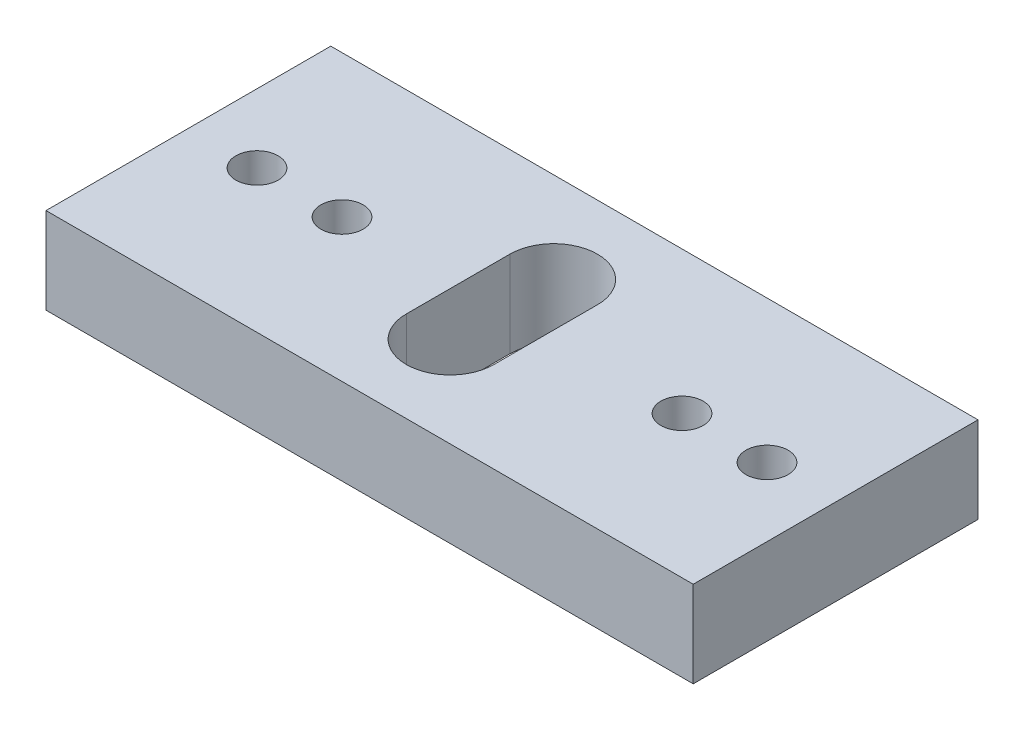
ISO-10303-21;
HEADER;
FILE_DESCRIPTION(('STEP AP214'),'2;1');
FILE_NAME('part.step','',(''),(''),'','','');
FILE_SCHEMA(('AUTOMOTIVE_DESIGN { 1 0 10303 214 1 1 1 1 }'));
ENDSEC;
DATA;
#1=APPLICATION_CONTEXT('core data for automotive mechanical design processes');
#2=APPLICATION_PROTOCOL_DEFINITION('international standard','automotive_design',2000,#1);
#3=PRODUCT_CONTEXT('',#1,'mechanical');
#4=PRODUCT('Part','Part','',(#3));
#5=PRODUCT_RELATED_PRODUCT_CATEGORY('part','',(#4));
#6=PRODUCT_DEFINITION_FORMATION('','',#4);
#7=PRODUCT_DEFINITION_CONTEXT('part definition',#1,'design');
#8=PRODUCT_DEFINITION('design','',#6,#7);
#9=PRODUCT_DEFINITION_SHAPE('','',#8);
#10=(LENGTH_UNIT() NAMED_UNIT(*) SI_UNIT(.MILLI.,.METRE.));
#11=(NAMED_UNIT(*) PLANE_ANGLE_UNIT() SI_UNIT($,.RADIAN.));
#12=(NAMED_UNIT(*) SI_UNIT($,.STERADIAN.) SOLID_ANGLE_UNIT());
#13=UNCERTAINTY_MEASURE_WITH_UNIT(LENGTH_MEASURE(1.E-05),#10,'distance_accuracy_value','');
#14=(GEOMETRIC_REPRESENTATION_CONTEXT(3) GLOBAL_UNCERTAINTY_ASSIGNED_CONTEXT((#13)) GLOBAL_UNIT_ASSIGNED_CONTEXT((#10,
#11,#12)) REPRESENTATION_CONTEXT('',''));
#15=CARTESIAN_POINT('',(0.,0.,0.));
#16=DIRECTION('',(0.,0.,1.));
#17=DIRECTION('',(1.,0.,0.));
#18=AXIS2_PLACEMENT_3D('',#15,#16,#17);
#19=CARTESIAN_POINT('',(0.,5.08,0.));
#20=DIRECTION('',(0.,-1.,0.));
#21=DIRECTION('',(0.,0.,-1.));
#22=AXIS2_PLACEMENT_3D('',#19,#20,#21);
#23=PLANE('',#22);
#24=CARTESIAN_POINT('',(-15.0114,5.08,0.));
#25=DIRECTION('',(0.,1.,0.));
#26=DIRECTION('',(0.,0.,1.));
#27=AXIS2_PLACEMENT_3D('',#24,#25,#26);
#28=CIRCLE('',#27,1.2446);
#29=CARTESIAN_POINT('',(-15.0114,5.08,1.2446));
#30=VERTEX_POINT('',#29);
#31=EDGE_CURVE('E137',#30,#30,#28,.T.);
#32=ORIENTED_EDGE('',*,*,#31,.F.);
#33=EDGE_LOOP('',(#32));
#34=FACE_BOUND('',#33,.T.);
#35=CARTESIAN_POINT('',(-10.0076,5.08,0.));
#36=DIRECTION('',(0.,1.,0.));
#37=DIRECTION('',(0.,0.,1.));
#38=AXIS2_PLACEMENT_3D('',#35,#36,#37);
#39=CIRCLE('',#38,1.2446);
#40=CARTESIAN_POINT('',(-10.0076,5.08,1.2446));
#41=VERTEX_POINT('',#40);
#42=EDGE_CURVE('E143',#41,#41,#39,.T.);
#43=ORIENTED_EDGE('',*,*,#42,.F.);
#44=EDGE_LOOP('',(#43));
#45=FACE_BOUND('',#44,.T.);
#46=DIRECTION('',(0.,0.,1.));
#47=VECTOR('',#46,1.);
#48=CARTESIAN_POINT('',(-19.05,5.08,-8.382));
#49=LINE('',#48,#47);
#50=CARTESIAN_POINT('',(-19.05,5.08,-8.382));
#51=VERTEX_POINT('',#50);
#52=CARTESIAN_POINT('',(-19.05,5.08,8.382));
#53=VERTEX_POINT('',#52);
#54=EDGE_CURVE('E149',#51,#53,#49,.T.);
#55=ORIENTED_EDGE('',*,*,#54,.T.);
#56=DIRECTION('',(1.,0.,0.));
#57=VECTOR('',#56,1.);
#58=CARTESIAN_POINT('',(19.05,5.08,8.382));
#59=LINE('',#58,#57);
#60=CARTESIAN_POINT('',(19.05,5.08,8.382));
#61=VERTEX_POINT('',#60);
#62=EDGE_CURVE('E152',#53,#61,#59,.T.);
#63=ORIENTED_EDGE('',*,*,#62,.T.);
#64=DIRECTION('',(0.,0.,-1.));
#65=VECTOR('',#64,1.);
#66=CARTESIAN_POINT('',(19.05,5.08,-8.382));
#67=LINE('',#66,#65);
#68=CARTESIAN_POINT('',(19.05,5.08,-8.382));
#69=VERTEX_POINT('',#68);
#70=EDGE_CURVE('E155',#61,#69,#67,.T.);
#71=ORIENTED_EDGE('',*,*,#70,.T.);
#72=DIRECTION('',(-1.,0.,0.));
#73=VECTOR('',#72,1.);
#74=CARTESIAN_POINT('',(19.05,5.08,-8.382));
#75=LINE('',#74,#73);
#76=EDGE_CURVE('E157',#69,#51,#75,.T.);
#77=ORIENTED_EDGE('',*,*,#76,.T.);
#78=EDGE_LOOP('',(#55,#63,#71,#77));
#79=FACE_BOUND('',#78,.T.);
#80=CARTESIAN_POINT('',(-0.595312500000001,5.08,-3.048));
#81=DIRECTION('',(0.,1.,0.));
#82=DIRECTION('',(0.,0.,1.));
#83=AXIS2_PLACEMENT_3D('',#80,#81,#82);
#84=CIRCLE('',#83,2.5796875);
#85=CARTESIAN_POINT('',(1.984375,5.08,-3.048));
#86=VERTEX_POINT('',#85);
#87=CARTESIAN_POINT('',(-3.175,5.08,-3.048));
#88=VERTEX_POINT('',#87);
#89=EDGE_CURVE('E98',#86,#88,#84,.T.);
#90=ORIENTED_EDGE('',*,*,#89,.F.);
#91=DIRECTION('',(0.,0.,-1.));
#92=VECTOR('',#91,1.);
#93=CARTESIAN_POINT('',(1.984375,5.08,3.048));
#94=LINE('',#93,#92);
#95=CARTESIAN_POINT('',(1.984375,5.08,3.048));
#96=VERTEX_POINT('',#95);
#97=EDGE_CURVE('E121',#96,#86,#94,.T.);
#98=ORIENTED_EDGE('',*,*,#97,.F.);
#99=CARTESIAN_POINT('',(-0.5953125,5.08,3.048));
#100=DIRECTION('',(0.,1.,0.));
#101=DIRECTION('',(0.,0.,-1.));
#102=AXIS2_PLACEMENT_3D('',#99,#100,#101);
#103=CIRCLE('',#102,2.5796875);
#104=CARTESIAN_POINT('',(-3.175,5.08,3.048));
#105=VERTEX_POINT('',#104);
#106=EDGE_CURVE('E119',#105,#96,#103,.T.);
#107=ORIENTED_EDGE('',*,*,#106,.F.);
#108=DIRECTION('',(0.,0.,1.));
#109=VECTOR('',#108,1.);
#110=CARTESIAN_POINT('',(-3.175,5.08,3.048));
#111=LINE('',#110,#109);
#112=EDGE_CURVE('E106',#88,#105,#111,.T.);
#113=ORIENTED_EDGE('',*,*,#112,.F.);
#114=EDGE_LOOP('',(#90,#98,#107,#113));
#115=FACE_BOUND('',#114,.T.);
#116=CARTESIAN_POINT('',(15.0114,5.08,0.));
#117=DIRECTION('',(0.,1.,0.));
#118=DIRECTION('',(0.,0.,-1.));
#119=AXIS2_PLACEMENT_3D('',#116,#117,#118);
#120=CIRCLE('',#119,1.2446);
#121=CARTESIAN_POINT('',(15.0114,5.08,-1.2446));
#122=VERTEX_POINT('',#121);
#123=EDGE_CURVE('E127',#122,#122,#120,.T.);
#124=ORIENTED_EDGE('',*,*,#123,.F.);
#125=EDGE_LOOP('',(#124));
#126=FACE_BOUND('',#125,.T.);
#127=CARTESIAN_POINT('',(10.0076,5.08,0.));
#128=DIRECTION('',(0.,1.,0.));
#129=DIRECTION('',(0.,0.,-1.));
#130=AXIS2_PLACEMENT_3D('',#127,#128,#129);
#131=CIRCLE('',#130,1.2446);
#132=CARTESIAN_POINT('',(10.0076,5.08,-1.2446));
#133=VERTEX_POINT('',#132);
#134=EDGE_CURVE('E254',#133,#133,#131,.T.);
#135=ORIENTED_EDGE('',*,*,#134,.F.);
#136=EDGE_LOOP('',(#135));
#137=FACE_BOUND('',#136,.T.);
#138=ADVANCED_FACE('F33',(#34,#45,#79,#115,#126,#137),#23,.F.);
#139=CARTESIAN_POINT('',(0.,0.,0.));
#140=DIRECTION('',(0.,-1.,0.));
#141=DIRECTION('',(0.,0.,-1.));
#142=AXIS2_PLACEMENT_3D('',#139,#140,#141);
#143=PLANE('',#142);
#144=CARTESIAN_POINT('',(15.0114,0.,0.));
#145=DIRECTION('',(0.,1.,0.));
#146=DIRECTION('',(0.,0.,-1.));
#147=AXIS2_PLACEMENT_3D('',#144,#145,#146);
#148=CIRCLE('',#147,1.2446);
#149=CARTESIAN_POINT('',(15.0114,0.,-1.2446));
#150=VERTEX_POINT('',#149);
#151=EDGE_CURVE('E260',#150,#150,#148,.T.);
#152=ORIENTED_EDGE('',*,*,#151,.T.);
#153=EDGE_LOOP('',(#152));
#154=FACE_BOUND('',#153,.T.);
#155=CARTESIAN_POINT('',(-10.0076,0.,0.));
#156=DIRECTION('',(0.,1.,0.));
#157=DIRECTION('',(0.,0.,1.));
#158=AXIS2_PLACEMENT_3D('',#155,#156,#157);
#159=CIRCLE('',#158,1.2446);
#160=CARTESIAN_POINT('',(-10.0076,0.,1.2446));
#161=VERTEX_POINT('',#160);
#162=EDGE_CURVE('E140',#161,#161,#159,.T.);
#163=ORIENTED_EDGE('',*,*,#162,.T.);
#164=EDGE_LOOP('',(#163));
#165=FACE_BOUND('',#164,.T.);
#166=DIRECTION('',(0.,0.,1.));
#167=VECTOR('',#166,1.);
#168=CARTESIAN_POINT('',(-19.05,0.,-8.382));
#169=LINE('',#168,#167);
#170=CARTESIAN_POINT('',(-19.05,0.,-8.382));
#171=VERTEX_POINT('',#170);
#172=CARTESIAN_POINT('',(-19.05,0.,8.382));
#173=VERTEX_POINT('',#172);
#174=EDGE_CURVE('E146',#171,#173,#169,.T.);
#175=ORIENTED_EDGE('',*,*,#174,.F.);
#176=DIRECTION('',(-1.,0.,0.));
#177=VECTOR('',#176,1.);
#178=CARTESIAN_POINT('',(19.05,0.,-8.382));
#179=LINE('',#178,#177);
#180=CARTESIAN_POINT('',(19.05,0.,-8.382));
#181=VERTEX_POINT('',#180);
#182=EDGE_CURVE('E153',#181,#171,#179,.T.);
#183=ORIENTED_EDGE('',*,*,#182,.F.);
#184=DIRECTION('',(0.,0.,-1.));
#185=VECTOR('',#184,1.);
#186=CARTESIAN_POINT('',(19.05,0.,-8.382));
#187=LINE('',#186,#185);
#188=CARTESIAN_POINT('',(19.05,0.,8.382));
#189=VERTEX_POINT('',#188);
#190=EDGE_CURVE('E164',#189,#181,#187,.T.);
#191=ORIENTED_EDGE('',*,*,#190,.F.);
#192=DIRECTION('',(1.,0.,0.));
#193=VECTOR('',#192,1.);
#194=CARTESIAN_POINT('',(19.05,0.,8.382));
#195=LINE('',#194,#193);
#196=EDGE_CURVE('E162',#173,#189,#195,.T.);
#197=ORIENTED_EDGE('',*,*,#196,.F.);
#198=EDGE_LOOP('',(#175,#183,#191,#197));
#199=FACE_BOUND('',#198,.T.);
#200=CARTESIAN_POINT('',(-15.0114,0.,0.));
#201=DIRECTION('',(0.,1.,0.));
#202=DIRECTION('',(0.,0.,1.));
#203=AXIS2_PLACEMENT_3D('',#200,#201,#202);
#204=CIRCLE('',#203,1.2446);
#205=CARTESIAN_POINT('',(-15.0114,0.,1.2446));
#206=VERTEX_POINT('',#205);
#207=EDGE_CURVE('E114',#206,#206,#204,.T.);
#208=ORIENTED_EDGE('',*,*,#207,.T.);
#209=EDGE_LOOP('',(#208));
#210=FACE_BOUND('',#209,.T.);
#211=DIRECTION('',(0.,0.,-1.));
#212=VECTOR('',#211,1.);
#213=CARTESIAN_POINT('',(1.984375,0.,3.048));
#214=LINE('',#213,#212);
#215=CARTESIAN_POINT('',(1.984375,0.,3.048));
#216=VERTEX_POINT('',#215);
#217=CARTESIAN_POINT('',(1.984375,0.,-3.048));
#218=VERTEX_POINT('',#217);
#219=EDGE_CURVE('E107',#216,#218,#214,.T.);
#220=ORIENTED_EDGE('',*,*,#219,.T.);
#221=CARTESIAN_POINT('',(-0.595312500000001,0.,-3.048));
#222=DIRECTION('',(0.,1.,0.));
#223=DIRECTION('',(0.,0.,1.));
#224=AXIS2_PLACEMENT_3D('',#221,#222,#223);
#225=CIRCLE('',#224,2.5796875);
#226=CARTESIAN_POINT('',(-3.175,0.,-3.048));
#227=VERTEX_POINT('',#226);
#228=EDGE_CURVE('E56',#218,#227,#225,.T.);
#229=ORIENTED_EDGE('',*,*,#228,.T.);
#230=DIRECTION('',(0.,0.,1.));
#231=VECTOR('',#230,1.);
#232=CARTESIAN_POINT('',(-3.175,0.,3.048));
#233=LINE('',#232,#231);
#234=CARTESIAN_POINT('',(-3.175,0.,3.048));
#235=VERTEX_POINT('',#234);
#236=EDGE_CURVE('E113',#227,#235,#233,.T.);
#237=ORIENTED_EDGE('',*,*,#236,.T.);
#238=CARTESIAN_POINT('',(-0.5953125,0.,3.048));
#239=DIRECTION('',(0.,1.,0.));
#240=DIRECTION('',(0.,0.,-1.));
#241=AXIS2_PLACEMENT_3D('',#238,#239,#240);
#242=CIRCLE('',#241,2.5796875);
#243=EDGE_CURVE('E129',#235,#216,#242,.T.);
#244=ORIENTED_EDGE('',*,*,#243,.T.);
#245=EDGE_LOOP('',(#220,#229,#237,#244));
#246=FACE_BOUND('',#245,.T.);
#247=CARTESIAN_POINT('',(10.0076,0.,0.));
#248=DIRECTION('',(0.,1.,0.));
#249=DIRECTION('',(0.,0.,-1.));
#250=AXIS2_PLACEMENT_3D('',#247,#248,#249);
#251=CIRCLE('',#250,1.2446);
#252=CARTESIAN_POINT('',(10.0076,0.,-1.2446));
#253=VERTEX_POINT('',#252);
#254=EDGE_CURVE('E257',#253,#253,#251,.T.);
#255=ORIENTED_EDGE('',*,*,#254,.T.);
#256=EDGE_LOOP('',(#255));
#257=FACE_BOUND('',#256,.T.);
#258=ADVANCED_FACE('F182',(#154,#165,#199,#210,#246,#257),#143,.T.);
#259=CARTESIAN_POINT('',(-19.05,5.08,-8.382));
#260=DIRECTION('',(1.,0.,0.));
#261=DIRECTION('',(0.,0.,-1.));
#262=AXIS2_PLACEMENT_3D('',#259,#260,#261);
#263=PLANE('',#262);
#264=ORIENTED_EDGE('',*,*,#174,.T.);
#265=DIRECTION('',(0.,-1.,0.));
#266=VECTOR('',#265,1.);
#267=CARTESIAN_POINT('',(-19.05,5.08,8.382));
#268=LINE('',#267,#266);
#269=EDGE_CURVE('E11',#53,#173,#268,.T.);
#270=ORIENTED_EDGE('',*,*,#269,.F.);
#271=ORIENTED_EDGE('',*,*,#54,.F.);
#272=DIRECTION('',(0.,-1.,0.));
#273=VECTOR('',#272,1.);
#274=CARTESIAN_POINT('',(-19.05,5.08,-8.382));
#275=LINE('',#274,#273);
#276=EDGE_CURVE('E159',#51,#171,#275,.T.);
#277=ORIENTED_EDGE('',*,*,#276,.T.);
#278=EDGE_LOOP('',(#264,#270,#271,#277));
#279=FACE_BOUND('',#278,.T.);
#280=ADVANCED_FACE('F35',(#279),#263,.F.);
#281=CARTESIAN_POINT('',(19.05,5.08,8.382));
#282=DIRECTION('',(0.,0.,-1.));
#283=DIRECTION('',(-1.,0.,0.));
#284=AXIS2_PLACEMENT_3D('',#281,#282,#283);
#285=PLANE('',#284);
#286=ORIENTED_EDGE('',*,*,#196,.T.);
#287=DIRECTION('',(0.,-1.,0.));
#288=VECTOR('',#287,1.);
#289=CARTESIAN_POINT('',(19.05,5.08,8.382));
#290=LINE('',#289,#288);
#291=EDGE_CURVE('E41',#61,#189,#290,.T.);
#292=ORIENTED_EDGE('',*,*,#291,.F.);
#293=ORIENTED_EDGE('',*,*,#62,.F.);
#294=ORIENTED_EDGE('',*,*,#269,.T.);
#295=EDGE_LOOP('',(#286,#292,#293,#294));
#296=FACE_BOUND('',#295,.T.);
#297=ADVANCED_FACE('F192',(#296),#285,.F.);
#298=CARTESIAN_POINT('',(19.05,5.08,-8.382));
#299=DIRECTION('',(-1.,0.,0.));
#300=DIRECTION('',(0.,0.,1.));
#301=AXIS2_PLACEMENT_3D('',#298,#299,#300);
#302=PLANE('',#301);
#303=ORIENTED_EDGE('',*,*,#190,.T.);
#304=DIRECTION('',(0.,-1.,0.));
#305=VECTOR('',#304,1.);
#306=CARTESIAN_POINT('',(19.05,5.08,-8.382));
#307=LINE('',#306,#305);
#308=EDGE_CURVE('E169',#69,#181,#307,.T.);
#309=ORIENTED_EDGE('',*,*,#308,.F.);
#310=ORIENTED_EDGE('',*,*,#70,.F.);
#311=ORIENTED_EDGE('',*,*,#291,.T.);
#312=EDGE_LOOP('',(#303,#309,#310,#311));
#313=FACE_BOUND('',#312,.T.);
#314=ADVANCED_FACE('F176',(#313),#302,.F.);
#315=CARTESIAN_POINT('',(19.05,5.08,-8.382));
#316=DIRECTION('',(0.,0.,1.));
#317=DIRECTION('',(1.,0.,0.));
#318=AXIS2_PLACEMENT_3D('',#315,#316,#317);
#319=PLANE('',#318);
#320=ORIENTED_EDGE('',*,*,#182,.T.);
#321=ORIENTED_EDGE('',*,*,#276,.F.);
#322=ORIENTED_EDGE('',*,*,#76,.F.);
#323=ORIENTED_EDGE('',*,*,#308,.T.);
#324=EDGE_LOOP('',(#320,#321,#322,#323));
#325=FACE_BOUND('',#324,.T.);
#326=ADVANCED_FACE('F186',(#325),#319,.F.);
#327=CARTESIAN_POINT('',(-10.0076,5.08,0.));
#328=DIRECTION('',(0.,-1.,0.));
#329=DIRECTION('',(0.,0.,-1.));
#330=AXIS2_PLACEMENT_3D('',#327,#328,#329);
#331=CYLINDRICAL_SURFACE('',#330,1.2446);
#332=ORIENTED_EDGE('',*,*,#42,.T.);
#333=EDGE_LOOP('',(#332));
#334=FACE_BOUND('',#333,.T.);
#335=ORIENTED_EDGE('',*,*,#162,.F.);
#336=EDGE_LOOP('',(#335));
#337=FACE_BOUND('',#336,.T.);
#338=ADVANCED_FACE('F210',(#334,#337),#331,.F.);
#339=CARTESIAN_POINT('',(-15.0114,5.08,0.));
#340=DIRECTION('',(0.,-1.,0.));
#341=DIRECTION('',(0.,0.,-1.));
#342=AXIS2_PLACEMENT_3D('',#339,#340,#341);
#343=CYLINDRICAL_SURFACE('',#342,1.2446);
#344=ORIENTED_EDGE('',*,*,#31,.T.);
#345=EDGE_LOOP('',(#344));
#346=FACE_BOUND('',#345,.T.);
#347=ORIENTED_EDGE('',*,*,#207,.F.);
#348=EDGE_LOOP('',(#347));
#349=FACE_BOUND('',#348,.T.);
#350=ADVANCED_FACE('F217',(#346,#349),#343,.F.);
#351=CARTESIAN_POINT('',(-0.595312500000001,5.08,-3.048));
#352=DIRECTION('',(0.,-1.,0.));
#353=DIRECTION('',(0.,0.,-1.));
#354=AXIS2_PLACEMENT_3D('',#351,#352,#353);
#355=CYLINDRICAL_SURFACE('',#354,2.5796875);
#356=ORIENTED_EDGE('',*,*,#228,.F.);
#357=DIRECTION('',(0.,-1.,0.));
#358=VECTOR('',#357,1.);
#359=CARTESIAN_POINT('',(1.984375,5.08,-3.048));
#360=LINE('',#359,#358);
#361=EDGE_CURVE('E102',#86,#218,#360,.T.);
#362=ORIENTED_EDGE('',*,*,#361,.F.);
#363=ORIENTED_EDGE('',*,*,#89,.T.);
#364=DIRECTION('',(0.,-1.,0.));
#365=VECTOR('',#364,1.);
#366=CARTESIAN_POINT('',(-3.175,5.08,-3.048));
#367=LINE('',#366,#365);
#368=EDGE_CURVE('E101',#88,#227,#367,.T.);
#369=ORIENTED_EDGE('',*,*,#368,.T.);
#370=EDGE_LOOP('',(#356,#362,#363,#369));
#371=FACE_BOUND('',#370,.T.);
#372=ADVANCED_FACE('F100',(#371),#355,.F.);
#373=CARTESIAN_POINT('',(-3.175,5.08,3.048));
#374=DIRECTION('',(1.,0.,0.));
#375=DIRECTION('',(0.,0.,-1.));
#376=AXIS2_PLACEMENT_3D('',#373,#374,#375);
#377=PLANE('',#376);
#378=ORIENTED_EDGE('',*,*,#236,.F.);
#379=ORIENTED_EDGE('',*,*,#368,.F.);
#380=ORIENTED_EDGE('',*,*,#112,.T.);
#381=DIRECTION('',(0.,-1.,0.));
#382=VECTOR('',#381,1.);
#383=CARTESIAN_POINT('',(-3.175,5.08,3.048));
#384=LINE('',#383,#382);
#385=EDGE_CURVE('E115',#105,#235,#384,.T.);
#386=ORIENTED_EDGE('',*,*,#385,.T.);
#387=EDGE_LOOP('',(#378,#379,#380,#386));
#388=FACE_BOUND('',#387,.T.);
#389=ADVANCED_FACE('F110',(#388),#377,.T.);
#390=CARTESIAN_POINT('',(-0.5953125,5.08,3.048));
#391=DIRECTION('',(0.,-1.,0.));
#392=DIRECTION('',(0.,0.,-1.));
#393=AXIS2_PLACEMENT_3D('',#390,#391,#392);
#394=CYLINDRICAL_SURFACE('',#393,2.5796875);
#395=ORIENTED_EDGE('',*,*,#243,.F.);
#396=ORIENTED_EDGE('',*,*,#385,.F.);
#397=ORIENTED_EDGE('',*,*,#106,.T.);
#398=DIRECTION('',(0.,-1.,0.));
#399=VECTOR('',#398,1.);
#400=CARTESIAN_POINT('',(1.984375,5.08,3.048));
#401=LINE('',#400,#399);
#402=EDGE_CURVE('E48',#96,#216,#401,.T.);
#403=ORIENTED_EDGE('',*,*,#402,.T.);
#404=EDGE_LOOP('',(#395,#396,#397,#403));
#405=FACE_BOUND('',#404,.T.);
#406=ADVANCED_FACE('F235',(#405),#394,.F.);
#407=CARTESIAN_POINT('',(1.984375,5.08,3.048));
#408=DIRECTION('',(-1.,0.,0.));
#409=DIRECTION('',(0.,0.,1.));
#410=AXIS2_PLACEMENT_3D('',#407,#408,#409);
#411=PLANE('',#410);
#412=ORIENTED_EDGE('',*,*,#219,.F.);
#413=ORIENTED_EDGE('',*,*,#402,.F.);
#414=ORIENTED_EDGE('',*,*,#97,.T.);
#415=ORIENTED_EDGE('',*,*,#361,.T.);
#416=EDGE_LOOP('',(#412,#413,#414,#415));
#417=FACE_BOUND('',#416,.T.);
#418=ADVANCED_FACE('F238',(#417),#411,.T.);
#419=CARTESIAN_POINT('',(15.0114,5.08,0.));
#420=DIRECTION('',(0.,-1.,0.));
#421=DIRECTION('',(0.,0.,-1.));
#422=AXIS2_PLACEMENT_3D('',#419,#420,#421);
#423=CYLINDRICAL_SURFACE('',#422,1.2446);
#424=ORIENTED_EDGE('',*,*,#123,.T.);
#425=EDGE_LOOP('',(#424));
#426=FACE_BOUND('',#425,.T.);
#427=ORIENTED_EDGE('',*,*,#151,.F.);
#428=EDGE_LOOP('',(#427));
#429=FACE_BOUND('',#428,.T.);
#430=ADVANCED_FACE('F242',(#426,#429),#423,.F.);
#431=CARTESIAN_POINT('',(10.0076,5.08,0.));
#432=DIRECTION('',(0.,-1.,0.));
#433=DIRECTION('',(0.,0.,-1.));
#434=AXIS2_PLACEMENT_3D('',#431,#432,#433);
#435=CYLINDRICAL_SURFACE('',#434,1.2446);
#436=ORIENTED_EDGE('',*,*,#134,.T.);
#437=EDGE_LOOP('',(#436));
#438=FACE_BOUND('',#437,.T.);
#439=ORIENTED_EDGE('',*,*,#254,.F.);
#440=EDGE_LOOP('',(#439));
#441=FACE_BOUND('',#440,.T.);
#442=ADVANCED_FACE('F245',(#438,#441),#435,.F.);
#443=CLOSED_SHELL('',(#138,#258,#280,#297,#314,#326,#338,#350,#372,#389,#406,#418,#430,#442));
#444=MANIFOLD_SOLID_BREP('B2',#443);
#445=ADVANCED_BREP_SHAPE_REPRESENTATION('',(#18,#444),#14);
#446=SHAPE_DEFINITION_REPRESENTATION(#9,#445);
ENDSEC;
END-ISO-10303-21;
